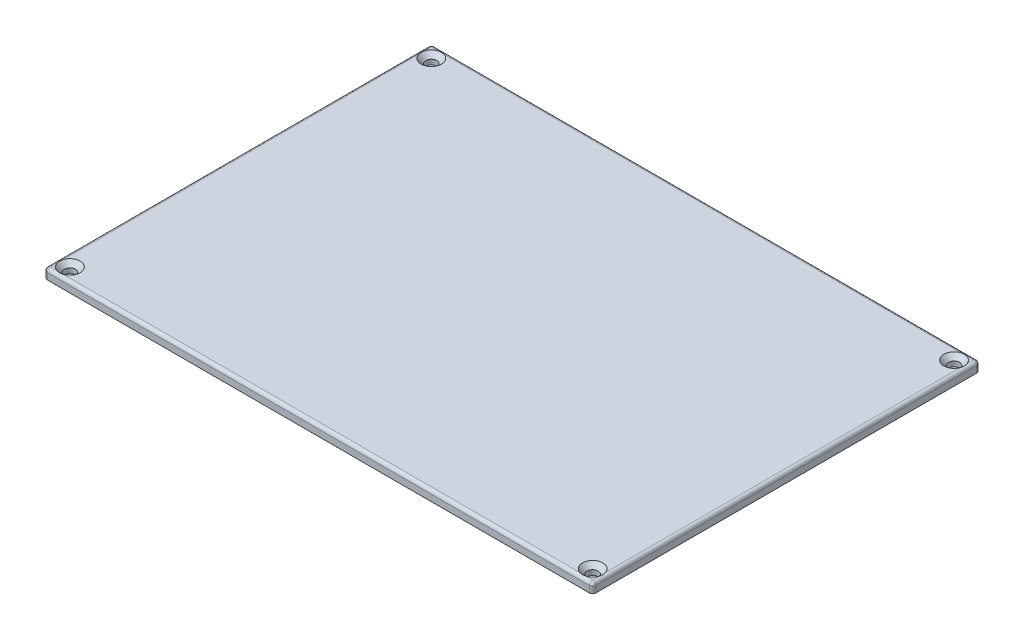
ISO-10303-21;
HEADER;
FILE_DESCRIPTION(('STEP AP214'),'2;1');
FILE_NAME('part.step','',(''),(''),'','','');
FILE_SCHEMA(('AUTOMOTIVE_DESIGN { 1 0 10303 214 1 1 1 1 }'));
ENDSEC;
DATA;
#1=APPLICATION_CONTEXT('core data for automotive mechanical design processes');
#2=APPLICATION_PROTOCOL_DEFINITION('international standard','automotive_design',2000,#1);
#3=PRODUCT_CONTEXT('',#1,'mechanical');
#4=PRODUCT('Part','Part','',(#3));
#5=PRODUCT_RELATED_PRODUCT_CATEGORY('part','',(#4));
#6=PRODUCT_DEFINITION_FORMATION('','',#4);
#7=PRODUCT_DEFINITION_CONTEXT('part definition',#1,'design');
#8=PRODUCT_DEFINITION('design','',#6,#7);
#9=PRODUCT_DEFINITION_SHAPE('','',#8);
#10=(LENGTH_UNIT() NAMED_UNIT(*) SI_UNIT(.MILLI.,.METRE.));
#11=(NAMED_UNIT(*) PLANE_ANGLE_UNIT() SI_UNIT($,.RADIAN.));
#12=(NAMED_UNIT(*) SI_UNIT($,.STERADIAN.) SOLID_ANGLE_UNIT());
#13=UNCERTAINTY_MEASURE_WITH_UNIT(LENGTH_MEASURE(1.E-05),#10,'distance_accuracy_value','');
#14=(GEOMETRIC_REPRESENTATION_CONTEXT(3) GLOBAL_UNCERTAINTY_ASSIGNED_CONTEXT((#13)) GLOBAL_UNIT_ASSIGNED_CONTEXT((#10,
#11,#12)) REPRESENTATION_CONTEXT('',''));
#15=CARTESIAN_POINT('',(0.,0.,0.));
#16=DIRECTION('',(0.,0.,1.));
#17=DIRECTION('',(1.,0.,0.));
#18=AXIS2_PLACEMENT_3D('',#15,#16,#17);
#19=CARTESIAN_POINT('',(0.,3.,0.));
#20=DIRECTION('',(0.,1.,0.));
#21=DIRECTION('',(0.,0.,1.));
#22=AXIS2_PLACEMENT_3D('',#19,#20,#21);
#23=PLANE('',#22);
#24=CARTESIAN_POINT('',(-151.564356435644,3.,-36.1584158415842));
#25=DIRECTION('',(0.,1.,0.));
#26=DIRECTION('',(0.,0.,1.));
#27=AXIS2_PLACEMENT_3D('',#24,#25,#26);
#28=CIRCLE('',#27,3.14999999999999);
#29=CARTESIAN_POINT('',(-154.564356435644,3.,-35.1979472059693));
#30=VERTEX_POINT('',#29);
#31=CARTESIAN_POINT('',(-150.603887800029,3.,-39.1584158415842));
#32=VERTEX_POINT('',#31);
#33=EDGE_CURVE('E167',#30,#32,#28,.T.);
#34=ORIENTED_EDGE('',*,*,#33,.F.);
#35=DIRECTION('',(0.,0.,1.));
#36=VECTOR('',#35,1.);
#37=CARTESIAN_POINT('',(-154.564356435644,3.,79.8415841584158));
#38=LINE('',#37,#36);
#39=CARTESIAN_POINT('',(-154.564356435644,3.,74.881115522801));
#40=VERTEX_POINT('',#39);
#41=EDGE_CURVE('E193',#30,#40,#38,.T.);
#42=ORIENTED_EDGE('',*,*,#41,.T.);
#43=CARTESIAN_POINT('',(-151.564356435644,3.,75.8415841584158));
#44=DIRECTION('',(0.,1.,0.));
#45=DIRECTION('',(0.,0.,1.));
#46=AXIS2_PLACEMENT_3D('',#43,#44,#45);
#47=CIRCLE('',#46,3.14999999999999);
#48=CARTESIAN_POINT('',(-150.603887800029,3.,78.8415841584158));
#49=VERTEX_POINT('',#48);
#50=EDGE_CURVE('E524',#49,#40,#47,.T.);
#51=ORIENTED_EDGE('',*,*,#50,.F.);
#52=DIRECTION('',(1.,0.,0.));
#53=VECTOR('',#52,1.);
#54=CARTESIAN_POINT('',(14.4356435643564,3.,78.8415841584158));
#55=LINE('',#54,#53);
#56=CARTESIAN_POINT('',(9.47517492874147,3.,78.8415841584158));
#57=VERTEX_POINT('',#56);
#58=EDGE_CURVE('E399',#49,#57,#55,.T.);
#59=ORIENTED_EDGE('',*,*,#58,.T.);
#60=CARTESIAN_POINT('',(10.4356435643564,3.,75.8415841584158));
#61=DIRECTION('',(0.,1.,0.));
#62=DIRECTION('',(0.,0.,1.));
#63=AXIS2_PLACEMENT_3D('',#60,#61,#62);
#64=CIRCLE('',#63,3.15);
#65=CARTESIAN_POINT('',(13.4356435643564,3.,74.881115522801));
#66=VERTEX_POINT('',#65);
#67=EDGE_CURVE('E499',#66,#57,#64,.T.);
#68=ORIENTED_EDGE('',*,*,#67,.F.);
#69=DIRECTION('',(0.,0.,1.));
#70=VECTOR('',#69,1.);
#71=CARTESIAN_POINT('',(13.4356435643564,3.,0.));
#72=LINE('',#71,#70);
#73=CARTESIAN_POINT('',(13.4356435643564,3.,-35.1979472059692));
#74=VERTEX_POINT('',#73);
#75=EDGE_CURVE('E386',#66,#74,#72,.F.);
#76=ORIENTED_EDGE('',*,*,#75,.T.);
#77=CARTESIAN_POINT('',(10.4356435643564,3.,-36.1584158415842));
#78=DIRECTION('',(0.,1.,0.));
#79=DIRECTION('',(0.,0.,1.));
#80=AXIS2_PLACEMENT_3D('',#77,#78,#79);
#81=CIRCLE('',#80,3.15);
#82=CARTESIAN_POINT('',(9.47517492874147,3.,-39.1584158415842));
#83=VERTEX_POINT('',#82);
#84=EDGE_CURVE('E170',#83,#74,#81,.T.);
#85=ORIENTED_EDGE('',*,*,#84,.F.);
#86=DIRECTION('',(1.,0.,0.));
#87=VECTOR('',#86,1.);
#88=CARTESIAN_POINT('',(0.,3.,-39.1584158415842));
#89=LINE('',#88,#87);
#90=EDGE_CURVE('E165',#83,#32,#89,.F.);
#91=ORIENTED_EDGE('',*,*,#90,.T.);
#92=EDGE_LOOP('',(#34,#42,#51,#59,#68,#76,#85,#91));
#93=FACE_BOUND('',#92,.T.);
#94=ADVANCED_FACE('F39',(#93),#23,.T.);
#95=CARTESIAN_POINT('',(-154.564356435644,3.,76.8020527940307));
#96=VERTEX_POINT('',#95);
#97=CARTESIAN_POINT('',(-152.524825071258,3.,78.8415841584158));
#98=VERTEX_POINT('',#97);
#99=EDGE_CURVE('E409',#96,#98,#47,.T.);
#100=ORIENTED_EDGE('',*,*,#99,.F.);
#101=DIRECTION('',(0.,0.,1.));
#102=VECTOR('',#101,1.);
#103=CARTESIAN_POINT('',(-154.564356435644,3.,79.8415841584158));
#104=LINE('',#103,#102);
#105=CARTESIAN_POINT('',(-154.564356435644,3.,78.8415841584158));
#106=VERTEX_POINT('',#105);
#107=EDGE_CURVE('E199',#96,#106,#104,.T.);
#108=ORIENTED_EDGE('',*,*,#107,.T.);
#109=DIRECTION('',(1.,0.,0.));
#110=VECTOR('',#109,1.);
#111=CARTESIAN_POINT('',(14.4356435643564,3.,78.8415841584158));
#112=LINE('',#111,#110);
#113=EDGE_CURVE('E402',#106,#98,#112,.T.);
#114=ORIENTED_EDGE('',*,*,#113,.T.);
#115=EDGE_LOOP('',(#100,#108,#114));
#116=FACE_BOUND('',#115,.T.);
#117=ADVANCED_FACE('F338',(#116),#23,.T.);
#118=CARTESIAN_POINT('',(11.3961121999713,3.,78.8415841584158));
#119=VERTEX_POINT('',#118);
#120=CARTESIAN_POINT('',(13.4356435643564,3.,76.8020527940307));
#121=VERTEX_POINT('',#120);
#122=EDGE_CURVE('E496',#119,#121,#64,.T.);
#123=ORIENTED_EDGE('',*,*,#122,.F.);
#124=DIRECTION('',(1.,0.,0.));
#125=VECTOR('',#124,1.);
#126=CARTESIAN_POINT('',(14.4356435643564,3.,78.8415841584158));
#127=LINE('',#126,#125);
#128=CARTESIAN_POINT('',(13.4356435643564,3.,78.8415841584158));
#129=VERTEX_POINT('',#128);
#130=EDGE_CURVE('E396',#119,#129,#127,.T.);
#131=ORIENTED_EDGE('',*,*,#130,.T.);
#132=DIRECTION('',(0.,0.,1.));
#133=VECTOR('',#132,1.);
#134=CARTESIAN_POINT('',(13.4356435643564,3.,0.));
#135=LINE('',#134,#133);
#136=EDGE_CURVE('E390',#129,#121,#135,.F.);
#137=ORIENTED_EDGE('',*,*,#136,.T.);
#138=EDGE_LOOP('',(#123,#131,#137));
#139=FACE_BOUND('',#138,.T.);
#140=ADVANCED_FACE('F343',(#139),#23,.T.);
#141=CARTESIAN_POINT('',(13.4356435643564,3.,-37.1188844771991));
#142=VERTEX_POINT('',#141);
#143=CARTESIAN_POINT('',(11.3961121999713,3.,-39.1584158415842));
#144=VERTEX_POINT('',#143);
#145=EDGE_CURVE('E369',#142,#144,#81,.T.);
#146=ORIENTED_EDGE('',*,*,#145,.F.);
#147=DIRECTION('',(0.,0.,1.));
#148=VECTOR('',#147,1.);
#149=CARTESIAN_POINT('',(13.4356435643564,3.,0.));
#150=LINE('',#149,#148);
#151=CARTESIAN_POINT('',(13.4356435643564,3.,-39.1584158415842));
#152=VERTEX_POINT('',#151);
#153=EDGE_CURVE('E371',#142,#152,#150,.F.);
#154=ORIENTED_EDGE('',*,*,#153,.T.);
#155=DIRECTION('',(1.,0.,0.));
#156=VECTOR('',#155,1.);
#157=CARTESIAN_POINT('',(0.,3.,-39.1584158415842));
#158=LINE('',#157,#156);
#159=EDGE_CURVE('E175',#152,#144,#158,.F.);
#160=ORIENTED_EDGE('',*,*,#159,.T.);
#161=EDGE_LOOP('',(#146,#154,#160));
#162=FACE_BOUND('',#161,.T.);
#163=ADVANCED_FACE('F350',(#162),#23,.T.);
#164=CARTESIAN_POINT('',(-155.564356435644,3.,-40.1584158415842));
#165=DIRECTION('',(1.,0.,0.));
#166=DIRECTION('',(0.,0.,-1.));
#167=AXIS2_PLACEMENT_3D('',#164,#165,#166);
#168=PLANE('',#167);
#169=DIRECTION('',(0.,0.,1.));
#170=VECTOR('',#169,1.);
#171=CARTESIAN_POINT('',(-155.564356435644,2.,-40.1584158415842));
#172=LINE('',#171,#170);
#173=CARTESIAN_POINT('',(-155.564356435644,2.,78.8415841584158));
#174=VERTEX_POINT('',#173);
#175=CARTESIAN_POINT('',(-155.564356435644,2.,-39.1584158415842));
#176=VERTEX_POINT('',#175);
#177=EDGE_CURVE('E427',#174,#176,#172,.F.);
#178=ORIENTED_EDGE('',*,*,#177,.T.);
#179=DIRECTION('',(0.,-1.,0.));
#180=VECTOR('',#179,1.);
#181=CARTESIAN_POINT('',(-155.564356435644,0.,-39.1584158415842));
#182=LINE('',#181,#180);
#183=CARTESIAN_POINT('',(-155.564356435644,0.,-39.1584158415842));
#184=VERTEX_POINT('',#183);
#185=EDGE_CURVE('E269',#176,#184,#182,.T.);
#186=ORIENTED_EDGE('',*,*,#185,.T.);
#187=DIRECTION('',(0.,0.,1.));
#188=VECTOR('',#187,1.);
#189=CARTESIAN_POINT('',(-155.564356435644,0.,-40.1584158415842));
#190=LINE('',#189,#188);
#191=CARTESIAN_POINT('',(-155.564356435644,0.,78.8415841584158));
#192=VERTEX_POINT('',#191);
#193=EDGE_CURVE('E536',#184,#192,#190,.T.);
#194=ORIENTED_EDGE('',*,*,#193,.T.);
#195=DIRECTION('',(0.,-1.,0.));
#196=VECTOR('',#195,1.);
#197=CARTESIAN_POINT('',(-155.564356435644,3.,78.8415841584158));
#198=LINE('',#197,#196);
#199=EDGE_CURVE('E306',#192,#174,#198,.F.);
#200=ORIENTED_EDGE('',*,*,#199,.T.);
#201=EDGE_LOOP('',(#178,#186,#194,#200));
#202=FACE_BOUND('',#201,.T.);
#203=ADVANCED_FACE('F314',(#202),#168,.F.);
#204=CARTESIAN_POINT('',(-155.564356435644,3.,79.8415841584158));
#205=DIRECTION('',(0.,0.,-1.));
#206=DIRECTION('',(-1.,0.,0.));
#207=AXIS2_PLACEMENT_3D('',#204,#205,#206);
#208=PLANE('',#207);
#209=DIRECTION('',(1.,0.,0.));
#210=VECTOR('',#209,1.);
#211=CARTESIAN_POINT('',(-155.564356435644,0.,79.8415841584158));
#212=LINE('',#211,#210);
#213=CARTESIAN_POINT('',(-154.564356435644,0.,79.8415841584158));
#214=VERTEX_POINT('',#213);
#215=CARTESIAN_POINT('',(13.4356435643564,0.,79.8415841584158));
#216=VERTEX_POINT('',#215);
#217=EDGE_CURVE('E540',#214,#216,#212,.T.);
#218=ORIENTED_EDGE('',*,*,#217,.T.);
#219=DIRECTION('',(0.,-1.,0.));
#220=VECTOR('',#219,1.);
#221=CARTESIAN_POINT('',(13.4356435643564,3.,79.8415841584158));
#222=LINE('',#221,#220);
#223=CARTESIAN_POINT('',(13.4356435643564,2.,79.8415841584158));
#224=VERTEX_POINT('',#223);
#225=EDGE_CURVE('E479',#216,#224,#222,.F.);
#226=ORIENTED_EDGE('',*,*,#225,.T.);
#227=DIRECTION('',(1.,0.,0.));
#228=VECTOR('',#227,1.);
#229=CARTESIAN_POINT('',(-155.564356435644,2.,79.8415841584158));
#230=LINE('',#229,#228);
#231=CARTESIAN_POINT('',(-154.564356435644,2.,79.8415841584158));
#232=VERTEX_POINT('',#231);
#233=EDGE_CURVE('E482',#224,#232,#230,.F.);
#234=ORIENTED_EDGE('',*,*,#233,.T.);
#235=DIRECTION('',(0.,-1.,0.));
#236=VECTOR('',#235,1.);
#237=CARTESIAN_POINT('',(-154.564356435644,3.,79.8415841584158));
#238=LINE('',#237,#236);
#239=EDGE_CURVE('E484',#232,#214,#238,.T.);
#240=ORIENTED_EDGE('',*,*,#239,.T.);
#241=EDGE_LOOP('',(#218,#226,#234,#240));
#242=FACE_BOUND('',#241,.T.);
#243=ADVANCED_FACE('F364',(#242),#208,.F.);
#244=CARTESIAN_POINT('',(14.4356435643564,3.,-40.1584158415842));
#245=DIRECTION('',(1.,0.,0.));
#246=DIRECTION('',(0.,0.,-1.));
#247=AXIS2_PLACEMENT_3D('',#244,#245,#246);
#248=PLANE('',#247);
#249=DIRECTION('',(0.,0.,1.));
#250=VECTOR('',#249,1.);
#251=CARTESIAN_POINT('',(14.4356435643564,0.,-40.1584158415842));
#252=LINE('',#251,#250);
#253=CARTESIAN_POINT('',(14.4356435643564,0.,-39.1584158415842));
#254=VERTEX_POINT('',#253);
#255=CARTESIAN_POINT('',(14.4356435643564,0.,78.8415841584158));
#256=VERTEX_POINT('',#255);
#257=EDGE_CURVE('E543',#254,#256,#252,.T.);
#258=ORIENTED_EDGE('',*,*,#257,.F.);
#259=DIRECTION('',(0.,-1.,0.));
#260=VECTOR('',#259,1.);
#261=CARTESIAN_POINT('',(14.4356435643564,3.,-39.1584158415842));
#262=LINE('',#261,#260);
#263=CARTESIAN_POINT('',(14.4356435643564,2.,-39.1584158415842));
#264=VERTEX_POINT('',#263);
#265=EDGE_CURVE('E468',#254,#264,#262,.F.);
#266=ORIENTED_EDGE('',*,*,#265,.T.);
#267=DIRECTION('',(0.,0.,1.));
#268=VECTOR('',#267,1.);
#269=CARTESIAN_POINT('',(14.4356435643564,2.,-40.1584158415842));
#270=LINE('',#269,#268);
#271=CARTESIAN_POINT('',(14.4356435643564,2.,78.8415841584158));
#272=VERTEX_POINT('',#271);
#273=EDGE_CURVE('E470',#264,#272,#270,.T.);
#274=ORIENTED_EDGE('',*,*,#273,.T.);
#275=DIRECTION('',(0.,-1.,0.));
#276=VECTOR('',#275,1.);
#277=CARTESIAN_POINT('',(14.4356435643564,0.,78.8415841584158));
#278=LINE('',#277,#276);
#279=EDGE_CURVE('E474',#272,#256,#278,.T.);
#280=ORIENTED_EDGE('',*,*,#279,.T.);
#281=EDGE_LOOP('',(#258,#266,#274,#280));
#282=FACE_BOUND('',#281,.T.);
#283=ADVANCED_FACE('F356',(#282),#248,.T.);
#284=CARTESIAN_POINT('',(-155.564356435644,3.,-40.1584158415842));
#285=DIRECTION('',(0.,0.,-1.));
#286=DIRECTION('',(-1.,0.,0.));
#287=AXIS2_PLACEMENT_3D('',#284,#285,#286);
#288=PLANE('',#287);
#289=DIRECTION('',(1.,0.,0.));
#290=VECTOR('',#289,1.);
#291=CARTESIAN_POINT('',(-155.564356435644,0.,-40.1584158415842));
#292=LINE('',#291,#290);
#293=CARTESIAN_POINT('',(-154.564356435644,0.,-40.1584158415842));
#294=VERTEX_POINT('',#293);
#295=CARTESIAN_POINT('',(13.4356435643564,0.,-40.1584158415842));
#296=VERTEX_POINT('',#295);
#297=EDGE_CURVE('E547',#294,#296,#292,.T.);
#298=ORIENTED_EDGE('',*,*,#297,.F.);
#299=DIRECTION('',(0.,-1.,0.));
#300=VECTOR('',#299,1.);
#301=CARTESIAN_POINT('',(-154.564356435644,3.,-40.1584158415842));
#302=LINE('',#301,#300);
#303=CARTESIAN_POINT('',(-154.564356435644,2.,-40.1584158415842));
#304=VERTEX_POINT('',#303);
#305=EDGE_CURVE('E11',#294,#304,#302,.F.);
#306=ORIENTED_EDGE('',*,*,#305,.T.);
#307=DIRECTION('',(1.,0.,0.));
#308=VECTOR('',#307,1.);
#309=CARTESIAN_POINT('',(-155.564356435644,2.,-40.1584158415842));
#310=LINE('',#309,#308);
#311=CARTESIAN_POINT('',(13.4356435643564,2.,-40.1584158415842));
#312=VERTEX_POINT('',#311);
#313=EDGE_CURVE('E56',#304,#312,#310,.T.);
#314=ORIENTED_EDGE('',*,*,#313,.T.);
#315=DIRECTION('',(0.,-1.,0.));
#316=VECTOR('',#315,1.);
#317=CARTESIAN_POINT('',(13.4356435643564,3.,-40.1584158415842));
#318=LINE('',#317,#316);
#319=EDGE_CURVE('E49',#312,#296,#318,.T.);
#320=ORIENTED_EDGE('',*,*,#319,.T.);
#321=EDGE_LOOP('',(#298,#306,#314,#320));
#322=FACE_BOUND('',#321,.T.);
#323=ADVANCED_FACE('F348',(#322),#288,.T.);
#324=DIRECTION('',(1.,0.,0.));
#325=VECTOR('',#324,1.);
#326=CARTESIAN_POINT('',(0.,3.,-39.1584158415842));
#327=LINE('',#326,#325);
#328=CARTESIAN_POINT('',(-152.524825071258,3.,-39.1584158415842));
#329=VERTEX_POINT('',#328);
#330=CARTESIAN_POINT('',(-154.564356435644,3.,-39.1584158415842));
#331=VERTEX_POINT('',#330);
#332=EDGE_CURVE('E191',#329,#331,#327,.F.);
#333=ORIENTED_EDGE('',*,*,#332,.T.);
#334=DIRECTION('',(0.,0.,1.));
#335=VECTOR('',#334,1.);
#336=CARTESIAN_POINT('',(-154.564356435644,3.,79.8415841584158));
#337=LINE('',#336,#335);
#338=CARTESIAN_POINT('',(-154.564356435644,3.,-37.118884477199));
#339=VERTEX_POINT('',#338);
#340=EDGE_CURVE('E176',#331,#339,#337,.T.);
#341=ORIENTED_EDGE('',*,*,#340,.T.);
#342=EDGE_CURVE('E185',#329,#339,#28,.T.);
#343=ORIENTED_EDGE('',*,*,#342,.F.);
#344=EDGE_LOOP('',(#333,#341,#343));
#345=FACE_BOUND('',#344,.T.);
#346=ADVANCED_FACE('F339',(#345),#23,.T.);
#347=CARTESIAN_POINT('',(0.,0.,0.));
#348=DIRECTION('',(0.,1.,0.));
#349=DIRECTION('',(0.,0.,1.));
#350=AXIS2_PLACEMENT_3D('',#347,#348,#349);
#351=PLANE('',#350);
#352=CARTESIAN_POINT('',(-151.564356435644,0.,-36.1584158415842));
#353=DIRECTION('',(0.,1.,0.));
#354=DIRECTION('',(0.,0.,1.));
#355=AXIS2_PLACEMENT_3D('',#352,#353,#354);
#356=CIRCLE('',#355,1.70000000000001);
#357=CARTESIAN_POINT('',(-151.564356435644,0.,-34.4584158415842));
#358=VERTEX_POINT('',#357);
#359=EDGE_CURVE('E560',#358,#358,#356,.T.);
#360=ORIENTED_EDGE('',*,*,#359,.T.);
#361=EDGE_LOOP('',(#360));
#362=FACE_BOUND('',#361,.T.);
#363=CARTESIAN_POINT('',(10.4356435643564,0.,-36.1584158415842));
#364=DIRECTION('',(0.,1.,0.));
#365=DIRECTION('',(0.,0.,1.));
#366=AXIS2_PLACEMENT_3D('',#363,#364,#365);
#367=CIRCLE('',#366,1.7);
#368=CARTESIAN_POINT('',(10.4356435643564,0.,-34.4584158415842));
#369=VERTEX_POINT('',#368);
#370=EDGE_CURVE('E511',#369,#369,#367,.T.);
#371=ORIENTED_EDGE('',*,*,#370,.T.);
#372=EDGE_LOOP('',(#371));
#373=FACE_BOUND('',#372,.T.);
#374=CARTESIAN_POINT('',(10.4356435643564,0.,75.8415841584158));
#375=DIRECTION('',(0.,1.,0.));
#376=DIRECTION('',(0.,0.,1.));
#377=AXIS2_PLACEMENT_3D('',#374,#375,#376);
#378=CIRCLE('',#377,1.7);
#379=CARTESIAN_POINT('',(10.4356435643564,0.,77.5415841584158));
#380=VERTEX_POINT('',#379);
#381=EDGE_CURVE('E520',#380,#380,#378,.T.);
#382=ORIENTED_EDGE('',*,*,#381,.T.);
#383=EDGE_LOOP('',(#382));
#384=FACE_BOUND('',#383,.T.);
#385=CARTESIAN_POINT('',(-151.564356435644,0.,75.8415841584158));
#386=DIRECTION('',(0.,1.,0.));
#387=DIRECTION('',(0.,0.,1.));
#388=AXIS2_PLACEMENT_3D('',#385,#386,#387);
#389=CIRCLE('',#388,1.70000000000001);
#390=CARTESIAN_POINT('',(-151.564356435644,0.,77.5415841584158));
#391=VERTEX_POINT('',#390);
#392=EDGE_CURVE('E532',#391,#391,#389,.T.);
#393=ORIENTED_EDGE('',*,*,#392,.T.);
#394=EDGE_LOOP('',(#393));
#395=FACE_BOUND('',#394,.T.);
#396=ORIENTED_EDGE('',*,*,#193,.F.);
#397=CARTESIAN_POINT('',(-154.564356435644,0.,-39.1584158415842));
#398=DIRECTION('',(0.,1.,0.));
#399=DIRECTION('',(0.,0.,1.));
#400=AXIS2_PLACEMENT_3D('',#397,#398,#399);
#401=CIRCLE('',#400,1.);
#402=EDGE_CURVE('E583',#184,#294,#401,.F.);
#403=ORIENTED_EDGE('',*,*,#402,.T.);
#404=ORIENTED_EDGE('',*,*,#297,.T.);
#405=CARTESIAN_POINT('',(13.4356435643564,0.,-39.1584158415842));
#406=DIRECTION('',(0.,1.,0.));
#407=DIRECTION('',(0.,0.,1.));
#408=AXIS2_PLACEMENT_3D('',#405,#406,#407);
#409=CIRCLE('',#408,1.);
#410=EDGE_CURVE('E589',#296,#254,#409,.F.);
#411=ORIENTED_EDGE('',*,*,#410,.T.);
#412=ORIENTED_EDGE('',*,*,#257,.T.);
#413=CARTESIAN_POINT('',(13.4356435643564,0.,78.8415841584158));
#414=DIRECTION('',(0.,1.,0.));
#415=DIRECTION('',(0.,0.,1.));
#416=AXIS2_PLACEMENT_3D('',#413,#414,#415);
#417=CIRCLE('',#416,1.);
#418=EDGE_CURVE('E594',#256,#216,#417,.F.);
#419=ORIENTED_EDGE('',*,*,#418,.T.);
#420=ORIENTED_EDGE('',*,*,#217,.F.);
#421=CARTESIAN_POINT('',(-154.564356435644,0.,78.8415841584158));
#422=DIRECTION('',(0.,1.,0.));
#423=DIRECTION('',(0.,0.,1.));
#424=AXIS2_PLACEMENT_3D('',#421,#422,#423);
#425=CIRCLE('',#424,1.);
#426=EDGE_CURVE('E249',#214,#192,#425,.F.);
#427=ORIENTED_EDGE('',*,*,#426,.T.);
#428=EDGE_LOOP('',(#396,#403,#404,#411,#412,#419,#420,#427));
#429=FACE_BOUND('',#428,.T.);
#430=ADVANCED_FACE('F347',(#362,#373,#384,#395,#429),#351,.F.);
#431=CARTESIAN_POINT('',(-151.564356435644,3.,75.8415841584158));
#432=DIRECTION('',(0.,1.,0.));
#433=DIRECTION('',(0.,0.,1.));
#434=AXIS2_PLACEMENT_3D('',#431,#432,#433);
#435=CYLINDRICAL_SURFACE('',#434,1.70000000000001);
#436=ORIENTED_EDGE('',*,*,#392,.F.);
#437=EDGE_LOOP('',(#436));
#438=FACE_BOUND('',#437,.T.);
#439=CARTESIAN_POINT('',(-151.564356435644,1.55,75.8415841584158));
#440=DIRECTION('',(0.,1.,0.));
#441=DIRECTION('',(0.,0.,1.));
#442=AXIS2_PLACEMENT_3D('',#439,#440,#441);
#443=CIRCLE('',#442,1.70000000000001);
#444=CARTESIAN_POINT('',(-151.564356435644,1.55,77.5415841584158));
#445=VERTEX_POINT('',#444);
#446=EDGE_CURVE('E528',#445,#445,#443,.T.);
#447=ORIENTED_EDGE('',*,*,#446,.T.);
#448=EDGE_LOOP('',(#447));
#449=FACE_BOUND('',#448,.T.);
#450=ADVANCED_FACE('F290',(#438,#449),#435,.F.);
#451=CARTESIAN_POINT('',(-151.564356435644,3.,75.8415841584158));
#452=DIRECTION('',(0.,1.,0.));
#453=DIRECTION('',(0.,0.,1.));
#454=AXIS2_PLACEMENT_3D('',#451,#452,#453);
#455=CONICAL_SURFACE('',#454,3.14999999999999,0.785398163397439);
#456=ORIENTED_EDGE('',*,*,#446,.F.);
#457=EDGE_LOOP('',(#456));
#458=FACE_BOUND('',#457,.T.);
#459=ORIENTED_EDGE('',*,*,#50,.T.);
#460=CARTESIAN_POINT('',(-154.564356435644,3.,74.881115522801));
#461=CARTESIAN_POINT('',(-154.576762643432,2.99999308135768,74.9198886007029));
#462=CARTESIAN_POINT('',(-154.588207050935,2.99976976919117,74.9589556070925));
#463=CARTESIAN_POINT('',(-154.609301129651,2.99904668278758,75.0375556047845));
#464=CARTESIAN_POINT('',(-154.61895141866,2.9985470039525,75.0770884306793));
#465=CARTESIAN_POINT('',(-154.645389997878,2.99686908431223,75.1961261639352));
#466=CARTESIAN_POINT('',(-154.659701825554,2.99551101759448,75.2761854040648));
#467=CARTESIAN_POINT('',(-154.682129088188,2.9931017854419,75.4354800492149));
#468=CARTESIAN_POINT('',(-154.690364961707,2.99204492492447,75.5146989481706));
#469=CARTESIAN_POINT('',(-154.701444105992,2.99057465315032,75.6735604900759));
#470=CARTESIAN_POINT('',(-154.704284453252,2.99016159075021,75.7532033393166));
#471=CARTESIAN_POINT('',(-154.704676075631,2.99010638556504,75.9139264746811));
#472=CARTESIAN_POINT('',(-154.70213192137,2.99047815198631,75.9950070131677));
#473=CARTESIAN_POINT('',(-154.691462734702,2.99190365790128,76.1567522002807));
#474=CARTESIAN_POINT('',(-154.683340627108,2.99295703997142,76.2374170445549));
#475=CARTESIAN_POINT('',(-154.660948611936,2.99539077262562,76.399654546606));
#476=CARTESIAN_POINT('',(-154.646552027828,2.99677758119737,76.4812101988049));
#477=CARTESIAN_POINT('',(-154.619816032061,2.99850020556819,76.602463432751));
#478=CARTESIAN_POINT('',(-154.610038077904,2.99901506278647,76.6427304008182));
#479=CARTESIAN_POINT('',(-154.588624974817,2.9997613068669,76.7227840605362));
#480=CARTESIAN_POINT('',(-154.576989162347,2.99999259219336,76.7625705751101));
#481=CARTESIAN_POINT('',(-154.564356435644,3.,76.8020527940307));
#482=B_SPLINE_CURVE_WITH_KNOTS('',3,(#460,#461,#462,#463,#464,#465,#466,#467,#468,#469,#470,
#471,#472,#473,#474,#475,#476,#477,#478,#479,#480,#481),.UNSPECIFIED.,.F.,.F.,(4,2,2,2,2,2,2,2,
2,2,4),(0.,0.122094478474057,0.244146836115708,0.487891197942856,0.72666368897198,
0.965565519365244,1.20873681942252,1.45178070926716,1.69997686031308,1.82425817826478,
1.94858398337796),.UNSPECIFIED.);
#483=EDGE_CURVE('E299',#40,#96,#482,.T.);
#484=ORIENTED_EDGE('',*,*,#483,.T.);
#485=ORIENTED_EDGE('',*,*,#99,.T.);
#486=CARTESIAN_POINT('',(-152.524825071258,3.,78.8415841584158));
#487=CARTESIAN_POINT('',(-152.486051993357,2.99999308135768,78.8539903662041));
#488=CARTESIAN_POINT('',(-152.446984986967,2.99976976919117,78.8654347737076));
#489=CARTESIAN_POINT('',(-152.368384989275,2.99904668278758,78.8865288524236));
#490=CARTESIAN_POINT('',(-152.32885216338,2.9985470039525,78.8961791414322));
#491=CARTESIAN_POINT('',(-152.209814430124,2.99686908431223,78.9226177206498));
#492=CARTESIAN_POINT('',(-152.129755189995,2.99551101759448,78.9369295483265));
#493=CARTESIAN_POINT('',(-151.970460544845,2.9931017854419,78.9593568109605));
#494=CARTESIAN_POINT('',(-151.891241645889,2.99204492492447,78.9675926844793));
#495=CARTESIAN_POINT('',(-151.732380103984,2.99057465315032,78.9786718287642));
#496=CARTESIAN_POINT('',(-151.652737254743,2.99016159075021,78.9815121760243));
#497=CARTESIAN_POINT('',(-151.492014119378,2.99010638556504,78.9819037984033));
#498=CARTESIAN_POINT('',(-151.410933580892,2.99047815198631,78.9793596441427));
#499=CARTESIAN_POINT('',(-151.249188393779,2.99190365790128,78.9686904574745));
#500=CARTESIAN_POINT('',(-151.168523549505,2.99295703997142,78.9605683498805));
#501=CARTESIAN_POINT('',(-151.006286047453,2.99539077262562,78.9381763347082));
#502=CARTESIAN_POINT('',(-150.924730395255,2.99677758119737,78.9237797505999));
#503=CARTESIAN_POINT('',(-150.803477161308,2.99850020556819,78.8970437548331));
#504=CARTESIAN_POINT('',(-150.763210193241,2.99901506278647,78.8872658006757));
#505=CARTESIAN_POINT('',(-150.683156533523,2.9997613068669,78.8658526975889));
#506=CARTESIAN_POINT('',(-150.643370018949,2.99999259219336,78.8542168851196));
#507=CARTESIAN_POINT('',(-150.603887800029,3.,78.8415841584158));
#508=B_SPLINE_CURVE_WITH_KNOTS('',3,(#486,#487,#488,#489,#490,#491,#492,#493,#494,#495,#496,
#497,#498,#499,#500,#501,#502,#503,#504,#505,#506,#507),.UNSPECIFIED.,.F.,.F.,(4,2,2,2,2,2,2,2,
2,2,4),(0.,0.122094478474075,0.244146836115708,0.487891197942843,0.726663688971953,
0.965565519365244,1.20873681942252,1.45178070926718,1.69997686031312,1.82425817826481,
1.94858398337801),.UNSPECIFIED.);
#509=EDGE_CURVE('E197',#98,#49,#508,.T.);
#510=ORIENTED_EDGE('',*,*,#509,.T.);
#511=EDGE_LOOP('',(#459,#484,#485,#510));
#512=FACE_BOUND('',#511,.T.);
#513=ADVANCED_FACE('F285',(#458,#512),#455,.F.);
#514=CARTESIAN_POINT('',(10.4356435643564,3.,75.8415841584158));
#515=DIRECTION('',(0.,1.,0.));
#516=DIRECTION('',(0.,0.,1.));
#517=AXIS2_PLACEMENT_3D('',#514,#515,#516);
#518=CYLINDRICAL_SURFACE('',#517,1.7);
#519=ORIENTED_EDGE('',*,*,#381,.F.);
#520=EDGE_LOOP('',(#519));
#521=FACE_BOUND('',#520,.T.);
#522=CARTESIAN_POINT('',(10.4356435643564,1.55,75.8415841584158));
#523=DIRECTION('',(0.,1.,0.));
#524=DIRECTION('',(0.,0.,1.));
#525=AXIS2_PLACEMENT_3D('',#522,#523,#524);
#526=CIRCLE('',#525,1.7);
#527=CARTESIAN_POINT('',(10.4356435643564,1.55,77.5415841584158));
#528=VERTEX_POINT('',#527);
#529=EDGE_CURVE('E503',#528,#528,#526,.T.);
#530=ORIENTED_EDGE('',*,*,#529,.T.);
#531=EDGE_LOOP('',(#530));
#532=FACE_BOUND('',#531,.T.);
#533=ADVANCED_FACE('F280',(#521,#532),#518,.F.);
#534=CARTESIAN_POINT('',(10.4356435643564,3.,75.8415841584158));
#535=DIRECTION('',(0.,1.,0.));
#536=DIRECTION('',(0.,0.,1.));
#537=AXIS2_PLACEMENT_3D('',#534,#535,#536);
#538=CONICAL_SURFACE('',#537,3.15,0.785398163397448);
#539=ORIENTED_EDGE('',*,*,#529,.F.);
#540=EDGE_LOOP('',(#539));
#541=FACE_BOUND('',#540,.T.);
#542=ORIENTED_EDGE('',*,*,#67,.T.);
#543=CARTESIAN_POINT('',(9.47517492874147,3.,78.8415841584158));
#544=CARTESIAN_POINT('',(9.51394800664341,2.99999308135768,78.8539903662041));
#545=CARTESIAN_POINT('',(9.55301501303299,2.99976976919117,78.8654347737076));
#546=CARTESIAN_POINT('',(9.631615010725,2.99904668278758,78.8865288524236));
#547=CARTESIAN_POINT('',(9.6711478366198,2.9985470039525,78.8961791414322));
#548=CARTESIAN_POINT('',(9.79018556987571,2.99686908431223,78.9226177206498));
#549=CARTESIAN_POINT('',(9.87024481000531,2.99551101759448,78.9369295483265));
#550=CARTESIAN_POINT('',(10.0295394551554,2.9931017854419,78.9593568109605));
#551=CARTESIAN_POINT('',(10.1087583541111,2.99204492492447,78.9675926844793));
#552=CARTESIAN_POINT('',(10.2676198960164,2.99057465315032,78.9786718287642));
#553=CARTESIAN_POINT('',(10.3472627452571,2.99016159075021,78.9815121760243));
#554=CARTESIAN_POINT('',(10.5079858806216,2.99010638556504,78.9819037984034));
#555=CARTESIAN_POINT('',(10.5890664191082,2.99047815198631,78.9793596441427));
#556=CARTESIAN_POINT('',(10.7508116062212,2.99190365790128,78.9686904574746));
#557=CARTESIAN_POINT('',(10.8314764504954,2.99295703997142,78.9605683498805));
#558=CARTESIAN_POINT('',(10.9937139525466,2.99539077262562,78.9381763347083));
#559=CARTESIAN_POINT('',(11.0752696047454,2.99677758119737,78.9237797505999));
#560=CARTESIAN_POINT('',(11.1965228386916,2.99850020556819,78.8970437548331));
#561=CARTESIAN_POINT('',(11.2367898067588,2.99901506278647,78.8872658006758));
#562=CARTESIAN_POINT('',(11.3168434664769,2.9997613068669,78.8658526975889));
#563=CARTESIAN_POINT('',(11.3566299810508,2.99999259219336,78.8542168851196));
#564=CARTESIAN_POINT('',(11.3961121999713,3.,78.8415841584158));
#565=B_SPLINE_CURVE_WITH_KNOTS('',3,(#543,#544,#545,#546,#547,#548,#549,#550,#551,#552,#553,
#554,#555,#556,#557,#558,#559,#560,#561,#562,#563,#564),.UNSPECIFIED.,.F.,.F.,(4,2,2,2,2,2,2,2,
2,2,4),(0.,0.122094478474051,0.244146836115704,0.487891197942838,0.726663688971959,
0.965565519365211,1.20873681942251,1.45178070926719,1.69997686031315,1.82425817826488,
1.94858398337807),.UNSPECIFIED.);
#566=EDGE_CURVE('E268',#57,#119,#565,.T.);
#567=ORIENTED_EDGE('',*,*,#566,.T.);
#568=ORIENTED_EDGE('',*,*,#122,.T.);
#569=CARTESIAN_POINT('',(13.4356435643564,3.,76.8020527940307));
#570=CARTESIAN_POINT('',(13.4480497721447,2.99999308135768,76.7632797161287));
#571=CARTESIAN_POINT('',(13.4594941796482,2.99976976919117,76.7242127097392));
#572=CARTESIAN_POINT('',(13.4805882583642,2.99904668278758,76.6456127120471));
#573=CARTESIAN_POINT('',(13.4902385473728,2.9985470039525,76.6060798861523));
#574=CARTESIAN_POINT('',(13.5166771265903,2.99686908431223,76.4870421528964));
#575=CARTESIAN_POINT('',(13.5309889542671,2.99551101759448,76.4069829127668));
#576=CARTESIAN_POINT('',(13.5534162169011,2.9931017854419,76.2476882676167));
#577=CARTESIAN_POINT('',(13.5616520904199,2.99204492492447,76.1684693686611));
#578=CARTESIAN_POINT('',(13.5727312347048,2.99057465315032,76.0096078267557));
#579=CARTESIAN_POINT('',(13.5755715819649,2.99016159075021,75.9299649775151));
#580=CARTESIAN_POINT('',(13.5759632043439,2.99010638556505,75.7692418421505));
#581=CARTESIAN_POINT('',(13.5734190500833,2.99047815198631,75.688161303664));
#582=CARTESIAN_POINT('',(13.5627498634151,2.99190365790128,75.526416116551));
#583=CARTESIAN_POINT('',(13.5546277558211,2.99295703997143,75.4457512722768));
#584=CARTESIAN_POINT('',(13.5322357406488,2.99539077262562,75.2835137702257));
#585=CARTESIAN_POINT('',(13.5178391565405,2.99677758119737,75.2019581180268));
#586=CARTESIAN_POINT('',(13.4911031607737,2.99850020556819,75.0807048840807));
#587=CARTESIAN_POINT('',(13.4813252066163,2.99901506278647,75.0404379160135));
#588=CARTESIAN_POINT('',(13.4599121035295,2.9997613068669,74.9603842562954));
#589=CARTESIAN_POINT('',(13.4482762910601,2.99999259219336,74.9205977417215));
#590=CARTESIAN_POINT('',(13.4356435643564,3.,74.881115522801));
#591=B_SPLINE_CURVE_WITH_KNOTS('',3,(#569,#570,#571,#572,#573,#574,#575,#576,#577,#578,#579,
#580,#581,#582,#583,#584,#585,#586,#587,#588,#589,#590),.UNSPECIFIED.,.F.,.F.,(4,2,2,2,2,2,2,2,
2,2,4),(0.,0.122094478474045,0.244146836115707,0.487891197942854,0.726663688971978,
0.965565519365242,1.20873681942249,1.45178070926713,1.69997686031302,1.82425817826474,
1.94858398337791),.UNSPECIFIED.);
#592=EDGE_CURVE('E260',#121,#66,#591,.T.);
#593=ORIENTED_EDGE('',*,*,#592,.T.);
#594=EDGE_LOOP('',(#542,#567,#568,#593));
#595=FACE_BOUND('',#594,.T.);
#596=ADVANCED_FACE('F276',(#541,#595),#538,.F.);
#597=CARTESIAN_POINT('',(10.4356435643564,3.,-36.1584158415842));
#598=DIRECTION('',(0.,1.,0.));
#599=DIRECTION('',(0.,0.,1.));
#600=AXIS2_PLACEMENT_3D('',#597,#598,#599);
#601=CYLINDRICAL_SURFACE('',#600,1.7);
#602=ORIENTED_EDGE('',*,*,#370,.F.);
#603=EDGE_LOOP('',(#602));
#604=FACE_BOUND('',#603,.T.);
#605=CARTESIAN_POINT('',(10.4356435643564,1.55,-36.1584158415842));
#606=DIRECTION('',(0.,1.,0.));
#607=DIRECTION('',(0.,0.,1.));
#608=AXIS2_PLACEMENT_3D('',#605,#606,#607);
#609=CIRCLE('',#608,1.7);
#610=CARTESIAN_POINT('',(10.4356435643564,1.55,-34.4584158415842));
#611=VERTEX_POINT('',#610);
#612=EDGE_CURVE('E376',#611,#611,#609,.T.);
#613=ORIENTED_EDGE('',*,*,#612,.T.);
#614=EDGE_LOOP('',(#613));
#615=FACE_BOUND('',#614,.T.);
#616=ADVANCED_FACE('F230',(#604,#615),#601,.F.);
#617=CARTESIAN_POINT('',(10.4356435643564,3.,-36.1584158415842));
#618=DIRECTION('',(0.,1.,0.));
#619=DIRECTION('',(0.,0.,1.));
#620=AXIS2_PLACEMENT_3D('',#617,#618,#619);
#621=CONICAL_SURFACE('',#620,3.15,0.785398163397448);
#622=ORIENTED_EDGE('',*,*,#612,.F.);
#623=EDGE_LOOP('',(#622));
#624=FACE_BOUND('',#623,.T.);
#625=ORIENTED_EDGE('',*,*,#84,.T.);
#626=CARTESIAN_POINT('',(13.4356435643564,3.,-35.1979472059692));
#627=CARTESIAN_POINT('',(13.4480497721447,2.99999308135768,-35.2367202838712));
#628=CARTESIAN_POINT('',(13.4594941796482,2.99976976919117,-35.2757872902608));
#629=CARTESIAN_POINT('',(13.4805882583642,2.99904668278758,-35.3543872879528));
#630=CARTESIAN_POINT('',(13.4902385473728,2.9985470039525,-35.3939201138476));
#631=CARTESIAN_POINT('',(13.5166771265903,2.99686908431223,-35.5129578471035));
#632=CARTESIAN_POINT('',(13.5309889542671,2.99551101759448,-35.5930170872331));
#633=CARTESIAN_POINT('',(13.5534162169011,2.9931017854419,-35.7523117323832));
#634=CARTESIAN_POINT('',(13.5616520904199,2.99204492492447,-35.8315306313388));
#635=CARTESIAN_POINT('',(13.5727312347048,2.99057465315032,-35.9903921732442));
#636=CARTESIAN_POINT('',(13.5755715819648,2.99016159075021,-36.0700350224848));
#637=CARTESIAN_POINT('',(13.5759632043439,2.99010638556504,-36.2307581578494));
#638=CARTESIAN_POINT('',(13.5734190500833,2.99047815198631,-36.311838696336));
#639=CARTESIAN_POINT('',(13.5627498634151,2.99190365790128,-36.473583883449));
#640=CARTESIAN_POINT('',(13.5546277558211,2.99295703997142,-36.5542487277232));
#641=CARTESIAN_POINT('',(13.5322357406488,2.99539077262562,-36.7164862297743));
#642=CARTESIAN_POINT('',(13.5178391565405,2.99677758119737,-36.7980418819732));
#643=CARTESIAN_POINT('',(13.4911031607737,2.99850020556819,-36.9192951159194));
#644=CARTESIAN_POINT('',(13.4813252066163,2.99901506278647,-36.9595620839865));
#645=CARTESIAN_POINT('',(13.4599121035295,2.9997613068669,-37.0396157437046));
#646=CARTESIAN_POINT('',(13.4482762910601,2.99999259219336,-37.0794022582785));
#647=CARTESIAN_POINT('',(13.4356435643564,3.,-37.1188844771991));
#648=B_SPLINE_CURVE_WITH_KNOTS('',3,(#626,#627,#628,#629,#630,#631,#632,#633,#634,#635,#636,
#637,#638,#639,#640,#641,#642,#643,#644,#645,#646,#647),.UNSPECIFIED.,.F.,.F.,(4,2,2,2,2,2,2,2,
2,2,4),(0.,0.122094478474046,0.244146836115708,0.487891197942843,0.726663688971961,
0.965565519365211,1.20873681942251,1.4517807092672,1.69997686031315,1.82425817826487,
1.94858398337808),.UNSPECIFIED.);
#649=EDGE_CURVE('E242',#74,#142,#648,.T.);
#650=ORIENTED_EDGE('',*,*,#649,.T.);
#651=ORIENTED_EDGE('',*,*,#145,.T.);
#652=CARTESIAN_POINT('',(11.3961121999713,3.,-39.1584158415842));
#653=CARTESIAN_POINT('',(11.3573391220694,2.99999308135768,-39.1708220493725));
#654=CARTESIAN_POINT('',(11.3182721156798,2.99976976919117,-39.182266456876));
#655=CARTESIAN_POINT('',(11.2396721179878,2.99904668278758,-39.203360535592));
#656=CARTESIAN_POINT('',(11.200139292093,2.9985470039525,-39.2130108246006));
#657=CARTESIAN_POINT('',(11.0811015588371,2.99686908431223,-39.2394494038181));
#658=CARTESIAN_POINT('',(11.0010423187075,2.99551101759448,-39.2537612314948));
#659=CARTESIAN_POINT('',(10.8417476735574,2.9931017854419,-39.2761884941288));
#660=CARTESIAN_POINT('',(10.7625287746017,2.99204492492447,-39.2844243676477));
#661=CARTESIAN_POINT('',(10.6036672326964,2.99057465315032,-39.2955035119326));
#662=CARTESIAN_POINT('',(10.5240243834557,2.99016159075021,-39.2983438591926));
#663=CARTESIAN_POINT('',(10.3633012480912,2.99010638556504,-39.2987354815717));
#664=CARTESIAN_POINT('',(10.2822207096046,2.99047815198631,-39.2961913273111));
#665=CARTESIAN_POINT('',(10.1204755224916,2.99190365790128,-39.2855221406429));
#666=CARTESIAN_POINT('',(10.0398106782173,2.99295703997142,-39.2774000330488));
#667=CARTESIAN_POINT('',(9.87757317616622,2.99539077262562,-39.2550080178766));
#668=CARTESIAN_POINT('',(9.79601752396736,2.99677758119737,-39.2406114337683));
#669=CARTESIAN_POINT('',(9.67476429002117,2.99850020556819,-39.2138754380015));
#670=CARTESIAN_POINT('',(9.634497321954,2.99901506278647,-39.2040974838441));
#671=CARTESIAN_POINT('',(9.55444366223593,2.9997613068669,-39.1826843807573));
#672=CARTESIAN_POINT('',(9.51465714766202,2.99999259219336,-39.1710485682879));
#673=CARTESIAN_POINT('',(9.47517492874147,3.,-39.1584158415842));
#674=B_SPLINE_CURVE_WITH_KNOTS('',3,(#652,#653,#654,#655,#656,#657,#658,#659,#660,#661,#662,
#663,#664,#665,#666,#667,#668,#669,#670,#671,#672,#673),.UNSPECIFIED.,.F.,.F.,(4,2,2,2,2,2,2,2,
2,2,4),(0.,0.122094478474041,0.244146836115695,0.487891197942836,0.726663688971958,
0.965565519365209,1.20873681942251,1.45178070926719,1.69997686031315,1.82425817826487,
1.94858398337807),.UNSPECIFIED.);
#675=EDGE_CURVE('E235',#144,#83,#674,.T.);
#676=ORIENTED_EDGE('',*,*,#675,.T.);
#677=EDGE_LOOP('',(#625,#650,#651,#676));
#678=FACE_BOUND('',#677,.T.);
#679=ADVANCED_FACE('F225',(#624,#678),#621,.F.);
#680=CARTESIAN_POINT('',(-151.564356435644,3.,-36.1584158415842));
#681=DIRECTION('',(0.,1.,0.));
#682=DIRECTION('',(0.,0.,1.));
#683=AXIS2_PLACEMENT_3D('',#680,#681,#682);
#684=CYLINDRICAL_SURFACE('',#683,1.70000000000001);
#685=ORIENTED_EDGE('',*,*,#359,.F.);
#686=EDGE_LOOP('',(#685));
#687=FACE_BOUND('',#686,.T.);
#688=CARTESIAN_POINT('',(-151.564356435644,1.55,-36.1584158415842));
#689=DIRECTION('',(0.,1.,0.));
#690=DIRECTION('',(0.,0.,1.));
#691=AXIS2_PLACEMENT_3D('',#688,#689,#690);
#692=CIRCLE('',#691,1.70000000000001);
#693=CARTESIAN_POINT('',(-151.564356435644,1.55,-34.4584158415842));
#694=VERTEX_POINT('',#693);
#695=EDGE_CURVE('E557',#694,#694,#692,.T.);
#696=ORIENTED_EDGE('',*,*,#695,.T.);
#697=EDGE_LOOP('',(#696));
#698=FACE_BOUND('',#697,.T.);
#699=ADVANCED_FACE('F220',(#687,#698),#684,.F.);
#700=CARTESIAN_POINT('',(-151.564356435644,3.,-36.1584158415842));
#701=DIRECTION('',(0.,1.,0.));
#702=DIRECTION('',(0.,0.,1.));
#703=AXIS2_PLACEMENT_3D('',#700,#701,#702);
#704=CONICAL_SURFACE('',#703,3.14999999999999,0.785398163397439);
#705=ORIENTED_EDGE('',*,*,#695,.F.);
#706=EDGE_LOOP('',(#705));
#707=FACE_BOUND('',#706,.T.);
#708=ORIENTED_EDGE('',*,*,#342,.T.);
#709=CARTESIAN_POINT('',(-154.564356435644,3.,-37.118884477199));
#710=CARTESIAN_POINT('',(-154.576762643432,2.99999308135768,-37.0801113992971));
#711=CARTESIAN_POINT('',(-154.588207050935,2.99976976919117,-37.0410443929075));
#712=CARTESIAN_POINT('',(-154.609301129651,2.99904668278758,-36.9624443952155));
#713=CARTESIAN_POINT('',(-154.61895141866,2.9985470039525,-36.9229115693207));
#714=CARTESIAN_POINT('',(-154.645389997878,2.99686908431223,-36.8038738360648));
#715=CARTESIAN_POINT('',(-154.659701825554,2.99551101759448,-36.7238145959352));
#716=CARTESIAN_POINT('',(-154.682129088188,2.9931017854419,-36.5645199507851));
#717=CARTESIAN_POINT('',(-154.690364961707,2.99204492492447,-36.4853010518295));
#718=CARTESIAN_POINT('',(-154.701444105992,2.99057465315032,-36.3264395099241));
#719=CARTESIAN_POINT('',(-154.704284453252,2.99016159075021,-36.2467966606835));
#720=CARTESIAN_POINT('',(-154.704676075631,2.99010638556504,-36.0860735253189));
#721=CARTESIAN_POINT('',(-154.70213192137,2.99047815198631,-36.0049929868323));
#722=CARTESIAN_POINT('',(-154.691462734702,2.99190365790128,-35.8432477997193));
#723=CARTESIAN_POINT('',(-154.683340627108,2.99295703997142,-35.7625829554451));
#724=CARTESIAN_POINT('',(-154.660948611936,2.99539077262562,-35.600345453394));
#725=CARTESIAN_POINT('',(-154.646552027828,2.99677758119737,-35.5187898011951));
#726=CARTESIAN_POINT('',(-154.619816032061,2.99850020556819,-35.397536567249));
#727=CARTESIAN_POINT('',(-154.610038077904,2.99901506278647,-35.3572695991818));
#728=CARTESIAN_POINT('',(-154.588624974817,2.9997613068669,-35.2772159394637));
#729=CARTESIAN_POINT('',(-154.576989162347,2.99999259219336,-35.2374294248898));
#730=CARTESIAN_POINT('',(-154.564356435644,3.,-35.1979472059693));
#731=B_SPLINE_CURVE_WITH_KNOTS('',3,(#709,#710,#711,#712,#713,#714,#715,#716,#717,#718,#719,
#720,#721,#722,#723,#724,#725,#726,#727,#728,#729,#730),.UNSPECIFIED.,.F.,.F.,(4,2,2,2,2,2,2,2,
2,2,4),(0.,0.122094478474044,0.244146836115701,0.487891197942836,0.72666368897196,
0.96556551936521,1.20873681942249,1.45178070926715,1.69997686031307,1.82425817826479,
1.94858398337798),.UNSPECIFIED.);
#732=EDGE_CURVE('E183',#339,#30,#731,.T.);
#733=ORIENTED_EDGE('',*,*,#732,.T.);
#734=ORIENTED_EDGE('',*,*,#33,.T.);
#735=CARTESIAN_POINT('',(-150.603887800029,3.,-39.1584158415842));
#736=CARTESIAN_POINT('',(-150.642660877931,2.99999308135768,-39.1708220493725));
#737=CARTESIAN_POINT('',(-150.68172788432,2.99976976919117,-39.182266456876));
#738=CARTESIAN_POINT('',(-150.760327882012,2.99904668278758,-39.203360535592));
#739=CARTESIAN_POINT('',(-150.799860707907,2.9985470039525,-39.2130108246006));
#740=CARTESIAN_POINT('',(-150.918898441163,2.99686908431223,-39.2394494038181));
#741=CARTESIAN_POINT('',(-150.998957681293,2.99551101759448,-39.2537612314948));
#742=CARTESIAN_POINT('',(-151.158252326443,2.9931017854419,-39.2761884941288));
#743=CARTESIAN_POINT('',(-151.237471225398,2.99204492492447,-39.2844243676477));
#744=CARTESIAN_POINT('',(-151.396332767304,2.99057465315032,-39.2955035119326));
#745=CARTESIAN_POINT('',(-151.475975616544,2.99016159075021,-39.2983438591926));
#746=CARTESIAN_POINT('',(-151.636698751909,2.99010638556504,-39.2987354815717));
#747=CARTESIAN_POINT('',(-151.717779290395,2.99047815198631,-39.2961913273111));
#748=CARTESIAN_POINT('',(-151.879524477508,2.99190365790128,-39.2855221406429));
#749=CARTESIAN_POINT('',(-151.960189321783,2.99295703997142,-39.2774000330488));
#750=CARTESIAN_POINT('',(-152.122426823834,2.99539077262562,-39.2550080178766));
#751=CARTESIAN_POINT('',(-152.203982476033,2.99677758119737,-39.2406114337682));
#752=CARTESIAN_POINT('',(-152.325235709979,2.99850020556819,-39.2138754380015));
#753=CARTESIAN_POINT('',(-152.365502678046,2.99901506278647,-39.2040974838441));
#754=CARTESIAN_POINT('',(-152.445556337764,2.9997613068669,-39.1826843807573));
#755=CARTESIAN_POINT('',(-152.485342852338,2.99999259219336,-39.1710485682879));
#756=CARTESIAN_POINT('',(-152.524825071258,3.,-39.1584158415842));
#757=B_SPLINE_CURVE_WITH_KNOTS('',3,(#735,#736,#737,#738,#739,#740,#741,#742,#743,#744,#745,
#746,#747,#748,#749,#750,#751,#752,#753,#754,#755,#756),.UNSPECIFIED.,.F.,.F.,(4,2,2,2,2,2,2,2,
2,2,4),(0.,0.122094478474044,0.244146836115678,0.487891197942841,0.726663688971979,
0.965565519365243,1.20873681942252,1.45178070926717,1.69997686031312,1.82425817826481,
1.94858398337801),.UNSPECIFIED.);
#758=EDGE_CURVE('E181',#32,#329,#757,.T.);
#759=ORIENTED_EDGE('',*,*,#758,.T.);
#760=EDGE_LOOP('',(#708,#733,#734,#759));
#761=FACE_BOUND('',#760,.T.);
#762=ADVANCED_FACE('F180',(#707,#761),#704,.F.);
#763=CARTESIAN_POINT('',(13.4356435643564,3.,-39.1584158415842));
#764=DIRECTION('',(0.,-1.,0.));
#765=DIRECTION('',(0.,0.,-1.));
#766=AXIS2_PLACEMENT_3D('',#763,#764,#765);
#767=CYLINDRICAL_SURFACE('',#766,1.);
#768=ORIENTED_EDGE('',*,*,#410,.F.);
#769=ORIENTED_EDGE('',*,*,#319,.F.);
#770=CARTESIAN_POINT('',(13.4356435643564,2.,-39.1584158415842));
#771=DIRECTION('',(0.,1.,0.));
#772=DIRECTION('',(0.,0.,1.));
#773=AXIS2_PLACEMENT_3D('',#770,#771,#772);
#774=CIRCLE('',#773,1.);
#775=EDGE_CURVE('E43',#264,#312,#774,.T.);
#776=ORIENTED_EDGE('',*,*,#775,.F.);
#777=ORIENTED_EDGE('',*,*,#265,.F.);
#778=EDGE_LOOP('',(#768,#769,#776,#777));
#779=FACE_BOUND('',#778,.T.);
#780=ADVANCED_FACE('F41',(#779),#767,.T.);
#781=CARTESIAN_POINT('',(13.4356435643564,2.,-40.1584158415842));
#782=DIRECTION('',(0.,0.,1.));
#783=DIRECTION('',(1.,0.,0.));
#784=AXIS2_PLACEMENT_3D('',#781,#782,#783);
#785=CYLINDRICAL_SURFACE('',#784,1.);
#786=CARTESIAN_POINT('',(13.4356435643564,2.,78.8415841584158));
#787=DIRECTION('',(0.,0.,1.));
#788=DIRECTION('',(1.,0.,0.));
#789=AXIS2_PLACEMENT_3D('',#786,#787,#788);
#790=CIRCLE('',#789,1.);
#791=EDGE_CURVE('E455',#272,#129,#790,.T.);
#792=ORIENTED_EDGE('',*,*,#791,.F.);
#793=ORIENTED_EDGE('',*,*,#273,.F.);
#794=CARTESIAN_POINT('',(13.4356435643564,2.,-39.1584158415842));
#795=DIRECTION('',(0.,0.,-1.));
#796=DIRECTION('',(-1.,0.,0.));
#797=AXIS2_PLACEMENT_3D('',#794,#795,#796);
#798=CIRCLE('',#797,1.);
#799=EDGE_CURVE('E383',#152,#264,#798,.T.);
#800=ORIENTED_EDGE('',*,*,#799,.F.);
#801=ORIENTED_EDGE('',*,*,#153,.F.);
#802=ORIENTED_EDGE('',*,*,#649,.F.);
#803=ORIENTED_EDGE('',*,*,#75,.F.);
#804=ORIENTED_EDGE('',*,*,#592,.F.);
#805=ORIENTED_EDGE('',*,*,#136,.F.);
#806=EDGE_LOOP('',(#792,#793,#800,#801,#802,#803,#804,#805));
#807=FACE_BOUND('',#806,.T.);
#808=ADVANCED_FACE('F251',(#807),#785,.T.);
#809=CARTESIAN_POINT('',(13.4356435643564,3.,78.8415841584158));
#810=DIRECTION('',(0.,1.,0.));
#811=DIRECTION('',(0.,0.,1.));
#812=AXIS2_PLACEMENT_3D('',#809,#810,#811);
#813=CYLINDRICAL_SURFACE('',#812,1.);
#814=ORIENTED_EDGE('',*,*,#418,.F.);
#815=ORIENTED_EDGE('',*,*,#279,.F.);
#816=CARTESIAN_POINT('',(13.4356435643564,2.,78.8415841584158));
#817=DIRECTION('',(0.,1.,0.));
#818=DIRECTION('',(0.,0.,1.));
#819=AXIS2_PLACEMENT_3D('',#816,#817,#818);
#820=CIRCLE('',#819,1.);
#821=EDGE_CURVE('E451',#224,#272,#820,.T.);
#822=ORIENTED_EDGE('',*,*,#821,.F.);
#823=ORIENTED_EDGE('',*,*,#225,.F.);
#824=EDGE_LOOP('',(#814,#815,#822,#823));
#825=FACE_BOUND('',#824,.T.);
#826=ADVANCED_FACE('F255',(#825),#813,.T.);
#827=CARTESIAN_POINT('',(13.4356435643564,2.,-39.1584158415842));
#828=DIRECTION('',(0.,0.,1.));
#829=DIRECTION('',(1.,0.,0.));
#830=AXIS2_PLACEMENT_3D('',#827,#828,#829);
#831=SPHERICAL_SURFACE('',#830,1.);
#832=ORIENTED_EDGE('',*,*,#799,.T.);
#833=ORIENTED_EDGE('',*,*,#775,.T.);
#834=CARTESIAN_POINT('',(13.4356435643564,2.,-39.1584158415842));
#835=DIRECTION('',(1.,0.,0.));
#836=DIRECTION('',(0.,0.,-1.));
#837=AXIS2_PLACEMENT_3D('',#834,#835,#836);
#838=CIRCLE('',#837,1.);
#839=EDGE_CURVE('E448',#152,#312,#838,.F.);
#840=ORIENTED_EDGE('',*,*,#839,.F.);
#841=EDGE_LOOP('',(#832,#833,#840));
#842=FACE_BOUND('',#841,.T.);
#843=ADVANCED_FACE('F463',(#842),#831,.T.);
#844=CARTESIAN_POINT('',(13.4356435643564,2.,78.8415841584158));
#845=DIRECTION('',(0.,0.,1.));
#846=DIRECTION('',(1.,0.,0.));
#847=AXIS2_PLACEMENT_3D('',#844,#845,#846);
#848=SPHERICAL_SURFACE('',#847,1.);
#849=ORIENTED_EDGE('',*,*,#821,.T.);
#850=ORIENTED_EDGE('',*,*,#791,.T.);
#851=CARTESIAN_POINT('',(13.4356435643564,2.,78.8415841584158));
#852=DIRECTION('',(1.,0.,0.));
#853=DIRECTION('',(0.,0.,-1.));
#854=AXIS2_PLACEMENT_3D('',#851,#852,#853);
#855=CIRCLE('',#854,1.);
#856=EDGE_CURVE('E444',#224,#129,#855,.F.);
#857=ORIENTED_EDGE('',*,*,#856,.F.);
#858=EDGE_LOOP('',(#849,#850,#857));
#859=FACE_BOUND('',#858,.T.);
#860=ADVANCED_FACE('F507',(#859),#848,.T.);
#861=CARTESIAN_POINT('',(-154.564356435644,3.,-39.1584158415842));
#862=DIRECTION('',(0.,1.,0.));
#863=DIRECTION('',(0.,0.,1.));
#864=AXIS2_PLACEMENT_3D('',#861,#862,#863);
#865=CYLINDRICAL_SURFACE('',#864,1.);
#866=ORIENTED_EDGE('',*,*,#402,.F.);
#867=ORIENTED_EDGE('',*,*,#185,.F.);
#868=CARTESIAN_POINT('',(-154.564356435644,2.,-39.1584158415842));
#869=DIRECTION('',(0.,1.,0.));
#870=DIRECTION('',(0.,0.,1.));
#871=AXIS2_PLACEMENT_3D('',#868,#869,#870);
#872=CIRCLE('',#871,1.);
#873=EDGE_CURVE('E440',#304,#176,#872,.T.);
#874=ORIENTED_EDGE('',*,*,#873,.F.);
#875=ORIENTED_EDGE('',*,*,#305,.F.);
#876=EDGE_LOOP('',(#866,#867,#874,#875));
#877=FACE_BOUND('',#876,.T.);
#878=ADVANCED_FACE('F335',(#877),#865,.T.);
#879=CARTESIAN_POINT('',(-155.564356435644,2.,-39.1584158415842));
#880=DIRECTION('',(1.,0.,0.));
#881=DIRECTION('',(0.,0.,-1.));
#882=AXIS2_PLACEMENT_3D('',#879,#880,#881);
#883=CYLINDRICAL_SURFACE('',#882,1.);
#884=ORIENTED_EDGE('',*,*,#839,.T.);
#885=ORIENTED_EDGE('',*,*,#313,.F.);
#886=CARTESIAN_POINT('',(-154.564356435644,2.,-39.1584158415842));
#887=DIRECTION('',(-1.,0.,0.));
#888=DIRECTION('',(0.,0.,1.));
#889=AXIS2_PLACEMENT_3D('',#886,#887,#888);
#890=CIRCLE('',#889,1.);
#891=EDGE_CURVE('E423',#331,#304,#890,.T.);
#892=ORIENTED_EDGE('',*,*,#891,.F.);
#893=ORIENTED_EDGE('',*,*,#332,.F.);
#894=ORIENTED_EDGE('',*,*,#758,.F.);
#895=ORIENTED_EDGE('',*,*,#90,.F.);
#896=ORIENTED_EDGE('',*,*,#675,.F.);
#897=ORIENTED_EDGE('',*,*,#159,.F.);
#898=EDGE_LOOP('',(#884,#885,#892,#893,#894,#895,#896,#897));
#899=FACE_BOUND('',#898,.T.);
#900=ADVANCED_FACE('F189',(#899),#883,.T.);
#901=CARTESIAN_POINT('',(0.,2.,78.8415841584158));
#902=DIRECTION('',(-1.,0.,0.));
#903=DIRECTION('',(0.,0.,1.));
#904=AXIS2_PLACEMENT_3D('',#901,#902,#903);
#905=CYLINDRICAL_SURFACE('',#904,1.);
#906=ORIENTED_EDGE('',*,*,#509,.F.);
#907=ORIENTED_EDGE('',*,*,#113,.F.);
#908=CARTESIAN_POINT('',(-154.564356435644,2.,78.8415841584158));
#909=DIRECTION('',(-1.,0.,0.));
#910=DIRECTION('',(0.,0.,1.));
#911=AXIS2_PLACEMENT_3D('',#908,#909,#910);
#912=CIRCLE('',#911,1.);
#913=EDGE_CURVE('E415',#232,#106,#912,.T.);
#914=ORIENTED_EDGE('',*,*,#913,.F.);
#915=ORIENTED_EDGE('',*,*,#233,.F.);
#916=ORIENTED_EDGE('',*,*,#856,.T.);
#917=ORIENTED_EDGE('',*,*,#130,.F.);
#918=ORIENTED_EDGE('',*,*,#566,.F.);
#919=ORIENTED_EDGE('',*,*,#58,.F.);
#920=EDGE_LOOP('',(#906,#907,#914,#915,#916,#917,#918,#919));
#921=FACE_BOUND('',#920,.T.);
#922=ADVANCED_FACE('F326',(#921),#905,.T.);
#923=CARTESIAN_POINT('',(-154.564356435644,3.,78.8415841584158));
#924=DIRECTION('',(0.,-1.,0.));
#925=DIRECTION('',(0.,0.,-1.));
#926=AXIS2_PLACEMENT_3D('',#923,#924,#925);
#927=CYLINDRICAL_SURFACE('',#926,1.);
#928=ORIENTED_EDGE('',*,*,#426,.F.);
#929=ORIENTED_EDGE('',*,*,#239,.F.);
#930=CARTESIAN_POINT('',(-154.564356435644,2.,78.8415841584158));
#931=DIRECTION('',(0.,1.,0.));
#932=DIRECTION('',(0.,0.,1.));
#933=AXIS2_PLACEMENT_3D('',#930,#931,#932);
#934=CIRCLE('',#933,1.);
#935=EDGE_CURVE('E421',#174,#232,#934,.T.);
#936=ORIENTED_EDGE('',*,*,#935,.F.);
#937=ORIENTED_EDGE('',*,*,#199,.F.);
#938=EDGE_LOOP('',(#928,#929,#936,#937));
#939=FACE_BOUND('',#938,.T.);
#940=ADVANCED_FACE('F323',(#939),#927,.T.);
#941=CARTESIAN_POINT('',(-154.564356435644,2.,-39.1584158415842));
#942=DIRECTION('',(0.,0.,1.));
#943=DIRECTION('',(1.,0.,0.));
#944=AXIS2_PLACEMENT_3D('',#941,#942,#943);
#945=SPHERICAL_SURFACE('',#944,1.);
#946=ORIENTED_EDGE('',*,*,#891,.T.);
#947=ORIENTED_EDGE('',*,*,#873,.T.);
#948=CARTESIAN_POINT('',(-154.564356435644,2.,-39.1584158415842));
#949=DIRECTION('',(0.,0.,-1.));
#950=DIRECTION('',(-1.,0.,0.));
#951=AXIS2_PLACEMENT_3D('',#948,#949,#950);
#952=CIRCLE('',#951,1.);
#953=EDGE_CURVE('E429',#331,#176,#952,.F.);
#954=ORIENTED_EDGE('',*,*,#953,.F.);
#955=EDGE_LOOP('',(#946,#947,#954));
#956=FACE_BOUND('',#955,.T.);
#957=ADVANCED_FACE('F319',(#956),#945,.T.);
#958=CARTESIAN_POINT('',(-154.564356435644,2.,78.8415841584158));
#959=DIRECTION('',(0.,0.,1.));
#960=DIRECTION('',(1.,0.,0.));
#961=AXIS2_PLACEMENT_3D('',#958,#959,#960);
#962=SPHERICAL_SURFACE('',#961,1.);
#963=ORIENTED_EDGE('',*,*,#935,.T.);
#964=ORIENTED_EDGE('',*,*,#913,.T.);
#965=CARTESIAN_POINT('',(-154.564356435644,2.,78.8415841584158));
#966=DIRECTION('',(0.,0.,1.));
#967=DIRECTION('',(1.,0.,0.));
#968=AXIS2_PLACEMENT_3D('',#965,#966,#967);
#969=CIRCLE('',#968,1.);
#970=EDGE_CURVE('E419',#174,#106,#969,.F.);
#971=ORIENTED_EDGE('',*,*,#970,.F.);
#972=EDGE_LOOP('',(#963,#964,#971));
#973=FACE_BOUND('',#972,.T.);
#974=ADVANCED_FACE('F312',(#973),#962,.T.);
#975=CARTESIAN_POINT('',(-154.564356435644,2.,0.));
#976=DIRECTION('',(0.,0.,-1.));
#977=DIRECTION('',(-1.,0.,0.));
#978=AXIS2_PLACEMENT_3D('',#975,#976,#977);
#979=CYLINDRICAL_SURFACE('',#978,1.);
#980=ORIENTED_EDGE('',*,*,#953,.T.);
#981=ORIENTED_EDGE('',*,*,#177,.F.);
#982=ORIENTED_EDGE('',*,*,#970,.T.);
#983=ORIENTED_EDGE('',*,*,#107,.F.);
#984=ORIENTED_EDGE('',*,*,#483,.F.);
#985=ORIENTED_EDGE('',*,*,#41,.F.);
#986=ORIENTED_EDGE('',*,*,#732,.F.);
#987=ORIENTED_EDGE('',*,*,#340,.F.);
#988=EDGE_LOOP('',(#980,#981,#982,#983,#984,#985,#986,#987));
#989=FACE_BOUND('',#988,.T.);
#990=ADVANCED_FACE('F307',(#989),#979,.T.);
#991=CLOSED_SHELL('',(#94,#117,#140,#163,#203,#243,#283,#323,#346,#430,#450,#513,#533,#596,#616,
#679,#699,#762,#780,#808,#826,#843,#860,#878,#900,#922,#940,#957,#974,#990));
#992=MANIFOLD_SOLID_BREP('B2',#991);
#993=ADVANCED_BREP_SHAPE_REPRESENTATION('',(#18,#992),#14);
#994=SHAPE_DEFINITION_REPRESENTATION(#9,#993);
ENDSEC;
END-ISO-10303-21;
